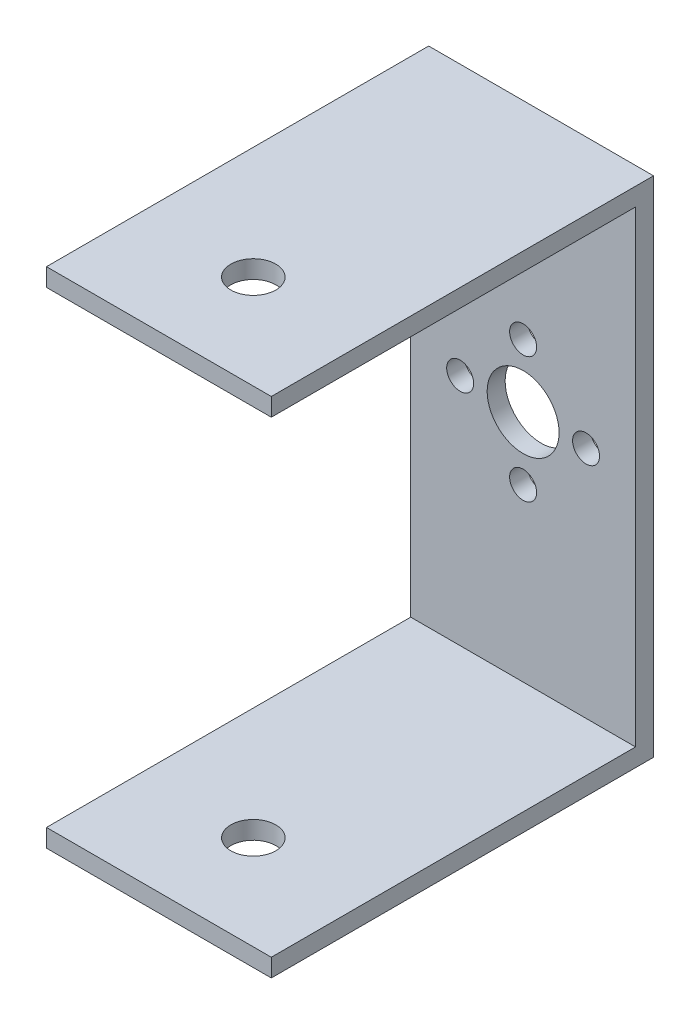
ISO-10303-21;
HEADER;
FILE_DESCRIPTION(('STEP AP214'),'2;1');
FILE_NAME('part.step','',(''),(''),'','','');
FILE_SCHEMA(('AUTOMOTIVE_DESIGN { 1 0 10303 214 1 1 1 1 }'));
ENDSEC;
DATA;
#1=APPLICATION_CONTEXT('core data for automotive mechanical design processes');
#2=APPLICATION_PROTOCOL_DEFINITION('international standard','automotive_design',2000,#1);
#3=PRODUCT_CONTEXT('',#1,'mechanical');
#4=PRODUCT('Part','Part','',(#3));
#5=PRODUCT_RELATED_PRODUCT_CATEGORY('part','',(#4));
#6=PRODUCT_DEFINITION_FORMATION('','',#4);
#7=PRODUCT_DEFINITION_CONTEXT('part definition',#1,'design');
#8=PRODUCT_DEFINITION('design','',#6,#7);
#9=PRODUCT_DEFINITION_SHAPE('','',#8);
#10=(LENGTH_UNIT() NAMED_UNIT(*) SI_UNIT(.MILLI.,.METRE.));
#11=(NAMED_UNIT(*) PLANE_ANGLE_UNIT() SI_UNIT($,.RADIAN.));
#12=(NAMED_UNIT(*) SI_UNIT($,.STERADIAN.) SOLID_ANGLE_UNIT());
#13=UNCERTAINTY_MEASURE_WITH_UNIT(LENGTH_MEASURE(1.E-05),#10,'distance_accuracy_value','');
#14=(GEOMETRIC_REPRESENTATION_CONTEXT(3) GLOBAL_UNCERTAINTY_ASSIGNED_CONTEXT((#13)) GLOBAL_UNIT_ASSIGNED_CONTEXT((#10,
#11,#12)) REPRESENTATION_CONTEXT('',''));
#15=CARTESIAN_POINT('',(0.,0.,0.));
#16=DIRECTION('',(0.,0.,1.));
#17=DIRECTION('',(1.,0.,0.));
#18=AXIS2_PLACEMENT_3D('',#15,#16,#17);
#19=CARTESIAN_POINT('',(-12.6747704507397,30.5029426241211,2.));
#20=DIRECTION('',(1.,0.,0.));
#21=DIRECTION('',(0.,1.,0.));
#22=AXIS2_PLACEMENT_3D('',#19,#20,#21);
#23=PLANE('',#22);
#24=DIRECTION('',(0.,-1.,0.));
#25=VECTOR('',#24,1.);
#26=CARTESIAN_POINT('',(-12.6747704507397,30.5029426241211,0.));
#27=LINE('',#26,#25);
#28=CARTESIAN_POINT('',(-12.6747704507397,32.5029426241211,0.));
#29=VERTEX_POINT('',#28);
#30=CARTESIAN_POINT('',(-12.6747704507397,-23.4970573758789,0.));
#31=VERTEX_POINT('',#30);
#32=EDGE_CURVE('E149',#29,#31,#27,.T.);
#33=ORIENTED_EDGE('',*,*,#32,.T.);
#34=DIRECTION('',(0.,0.,-1.));
#35=VECTOR('',#34,1.);
#36=CARTESIAN_POINT('',(-12.6747704507397,-23.4970573758789,0.));
#37=LINE('',#36,#35);
#38=CARTESIAN_POINT('',(-12.6747704507397,-23.4970573758789,42.5));
#39=VERTEX_POINT('',#38);
#40=EDGE_CURVE('E108',#39,#31,#37,.T.);
#41=ORIENTED_EDGE('',*,*,#40,.F.);
#42=DIRECTION('',(0.,1.,0.));
#43=VECTOR('',#42,1.);
#44=CARTESIAN_POINT('',(-12.6747704507397,-23.4970573758789,42.5));
#45=LINE('',#44,#43);
#46=CARTESIAN_POINT('',(-12.6747704507397,-21.4970573758789,42.5));
#47=VERTEX_POINT('',#46);
#48=EDGE_CURVE('E104',#39,#47,#45,.T.);
#49=ORIENTED_EDGE('',*,*,#48,.T.);
#50=DIRECTION('',(0.,0.,-1.));
#51=VECTOR('',#50,1.);
#52=CARTESIAN_POINT('',(-12.6747704507397,-21.4970573758789,0.));
#53=LINE('',#52,#51);
#54=CARTESIAN_POINT('',(-12.6747704507397,-21.4970573758789,2.));
#55=VERTEX_POINT('',#54);
#56=EDGE_CURVE('E117',#47,#55,#53,.T.);
#57=ORIENTED_EDGE('',*,*,#56,.T.);
#58=DIRECTION('',(0.,-1.,0.));
#59=VECTOR('',#58,1.);
#60=CARTESIAN_POINT('',(-12.6747704507397,30.5029426241211,2.));
#61=LINE('',#60,#59);
#62=CARTESIAN_POINT('',(-12.6747704507397,30.5029426241211,2.));
#63=VERTEX_POINT('',#62);
#64=EDGE_CURVE('E142',#63,#55,#61,.T.);
#65=ORIENTED_EDGE('',*,*,#64,.F.);
#66=DIRECTION('',(0.,0.,1.));
#67=VECTOR('',#66,1.);
#68=CARTESIAN_POINT('',(-12.6747704507397,30.5029426241211,0.));
#69=LINE('',#68,#67);
#70=CARTESIAN_POINT('',(-12.6747704507397,30.5029426241211,42.5));
#71=VERTEX_POINT('',#70);
#72=EDGE_CURVE('E49',#63,#71,#69,.T.);
#73=ORIENTED_EDGE('',*,*,#72,.T.);
#74=DIRECTION('',(0.,-1.,0.));
#75=VECTOR('',#74,1.);
#76=CARTESIAN_POINT('',(-12.6747704507397,32.5029426241211,42.5));
#77=LINE('',#76,#75);
#78=CARTESIAN_POINT('',(-12.6747704507397,32.5029426241211,42.5));
#79=VERTEX_POINT('',#78);
#80=EDGE_CURVE('E164',#79,#71,#77,.T.);
#81=ORIENTED_EDGE('',*,*,#80,.F.);
#82=DIRECTION('',(0.,0.,1.));
#83=VECTOR('',#82,1.);
#84=CARTESIAN_POINT('',(-12.6747704507397,32.5029426241211,0.));
#85=LINE('',#84,#83);
#86=EDGE_CURVE('E182',#29,#79,#85,.T.);
#87=ORIENTED_EDGE('',*,*,#86,.F.);
#88=EDGE_LOOP('',(#33,#41,#49,#57,#65,#73,#81,#87));
#89=FACE_BOUND('',#88,.T.);
#90=ADVANCED_FACE('F33',(#89),#23,.F.);
#91=CARTESIAN_POINT('',(12.3252295492603,30.5029426241211,2.));
#92=DIRECTION('',(-1.,0.,0.));
#93=DIRECTION('',(0.,-1.,0.));
#94=AXIS2_PLACEMENT_3D('',#91,#92,#93);
#95=PLANE('',#94);
#96=DIRECTION('',(0.,1.,0.));
#97=VECTOR('',#96,1.);
#98=CARTESIAN_POINT('',(12.3252295492603,30.5029426241211,0.));
#99=LINE('',#98,#97);
#100=CARTESIAN_POINT('',(12.3252295492603,-23.4970573758789,0.));
#101=VERTEX_POINT('',#100);
#102=CARTESIAN_POINT('',(12.3252295492603,32.5029426241211,0.));
#103=VERTEX_POINT('',#102);
#104=EDGE_CURVE('E147',#101,#103,#99,.T.);
#105=ORIENTED_EDGE('',*,*,#104,.T.);
#106=DIRECTION('',(0.,0.,-1.));
#107=VECTOR('',#106,1.);
#108=CARTESIAN_POINT('',(12.3252295492603,32.5029426241211,0.));
#109=LINE('',#108,#107);
#110=CARTESIAN_POINT('',(12.3252295492603,32.5029426241211,42.5));
#111=VERTEX_POINT('',#110);
#112=EDGE_CURVE('E188',#111,#103,#109,.T.);
#113=ORIENTED_EDGE('',*,*,#112,.F.);
#114=DIRECTION('',(0.,-1.,0.));
#115=VECTOR('',#114,1.);
#116=CARTESIAN_POINT('',(12.3252295492603,32.5029426241211,42.5));
#117=LINE('',#116,#115);
#118=CARTESIAN_POINT('',(12.3252295492603,30.5029426241211,42.5));
#119=VERTEX_POINT('',#118);
#120=EDGE_CURVE('E167',#111,#119,#117,.T.);
#121=ORIENTED_EDGE('',*,*,#120,.T.);
#122=DIRECTION('',(0.,0.,-1.));
#123=VECTOR('',#122,1.);
#124=CARTESIAN_POINT('',(12.3252295492603,30.5029426241211,0.));
#125=LINE('',#124,#123);
#126=CARTESIAN_POINT('',(12.3252295492603,30.5029426241211,2.));
#127=VERTEX_POINT('',#126);
#128=EDGE_CURVE('E160',#119,#127,#125,.T.);
#129=ORIENTED_EDGE('',*,*,#128,.T.);
#130=DIRECTION('',(0.,1.,0.));
#131=VECTOR('',#130,1.);
#132=CARTESIAN_POINT('',(12.3252295492603,30.5029426241211,2.));
#133=LINE('',#132,#131);
#134=CARTESIAN_POINT('',(12.3252295492603,-21.4970573758789,2.));
#135=VERTEX_POINT('',#134);
#136=EDGE_CURVE('E41',#135,#127,#133,.T.);
#137=ORIENTED_EDGE('',*,*,#136,.F.);
#138=DIRECTION('',(0.,0.,1.));
#139=VECTOR('',#138,1.);
#140=CARTESIAN_POINT('',(12.3252295492603,-21.4970573758789,0.));
#141=LINE('',#140,#139);
#142=CARTESIAN_POINT('',(12.3252295492603,-21.4970573758789,42.5));
#143=VERTEX_POINT('',#142);
#144=EDGE_CURVE('E56',#135,#143,#141,.T.);
#145=ORIENTED_EDGE('',*,*,#144,.T.);
#146=DIRECTION('',(0.,1.,0.));
#147=VECTOR('',#146,1.);
#148=CARTESIAN_POINT('',(12.3252295492603,-23.4970573758789,42.5));
#149=LINE('',#148,#147);
#150=CARTESIAN_POINT('',(12.3252295492603,-23.4970573758789,42.5));
#151=VERTEX_POINT('',#150);
#152=EDGE_CURVE('E102',#151,#143,#149,.T.);
#153=ORIENTED_EDGE('',*,*,#152,.F.);
#154=DIRECTION('',(0.,0.,1.));
#155=VECTOR('',#154,1.);
#156=CARTESIAN_POINT('',(12.3252295492603,-23.4970573758789,0.));
#157=LINE('',#156,#155);
#158=EDGE_CURVE('E109',#101,#151,#157,.T.);
#159=ORIENTED_EDGE('',*,*,#158,.F.);
#160=EDGE_LOOP('',(#105,#113,#121,#129,#137,#145,#153,#159));
#161=FACE_BOUND('',#160,.T.);
#162=ADVANCED_FACE('F119',(#161),#95,.F.);
#163=CARTESIAN_POINT('',(0.,0.,2.));
#164=DIRECTION('',(0.,0.,1.));
#165=DIRECTION('',(1.,0.,0.));
#166=AXIS2_PLACEMENT_3D('',#163,#164,#165);
#167=PLANE('',#166);
#168=CARTESIAN_POINT('',(-0.174770450739801,11.5029426241211,2.));
#169=DIRECTION('',(0.,0.,1.));
#170=DIRECTION('',(1.,0.,0.));
#171=AXIS2_PLACEMENT_3D('',#168,#169,#170);
#172=CIRCLE('',#171,1.5);
#173=CARTESIAN_POINT('',(1.3252295492602,11.5029426241211,2.));
#174=VERTEX_POINT('',#173);
#175=EDGE_CURVE('E340',#174,#174,#172,.T.);
#176=ORIENTED_EDGE('',*,*,#175,.F.);
#177=EDGE_LOOP('',(#176));
#178=FACE_BOUND('',#177,.T.);
#179=CARTESIAN_POINT('',(6.82522954926027,4.50294262412115,2.));
#180=DIRECTION('',(0.,0.,1.));
#181=DIRECTION('',(1.,0.,0.));
#182=AXIS2_PLACEMENT_3D('',#179,#180,#181);
#183=CIRCLE('',#182,1.5);
#184=CARTESIAN_POINT('',(8.32522954926028,4.50294262412115,2.));
#185=VERTEX_POINT('',#184);
#186=EDGE_CURVE('E350',#185,#185,#183,.T.);
#187=ORIENTED_EDGE('',*,*,#186,.F.);
#188=EDGE_LOOP('',(#187));
#189=FACE_BOUND('',#188,.T.);
#190=CARTESIAN_POINT('',(-0.174770450739701,-2.4970573758789,2.));
#191=DIRECTION('',(0.,0.,1.));
#192=DIRECTION('',(1.,0.,0.));
#193=AXIS2_PLACEMENT_3D('',#190,#191,#192);
#194=CIRCLE('',#193,1.5);
#195=CARTESIAN_POINT('',(1.3252295492603,-2.4970573758789,2.));
#196=VERTEX_POINT('',#195);
#197=EDGE_CURVE('E356',#196,#196,#194,.T.);
#198=ORIENTED_EDGE('',*,*,#197,.F.);
#199=EDGE_LOOP('',(#198));
#200=FACE_BOUND('',#199,.T.);
#201=CARTESIAN_POINT('',(-7.17477045073973,4.5029426241211,2.));
#202=DIRECTION('',(0.,0.,1.));
#203=DIRECTION('',(1.,0.,0.));
#204=AXIS2_PLACEMENT_3D('',#201,#202,#203);
#205=CIRCLE('',#204,1.5);
#206=CARTESIAN_POINT('',(-5.67477045073973,4.5029426241211,2.));
#207=VERTEX_POINT('',#206);
#208=EDGE_CURVE('E362',#207,#207,#205,.T.);
#209=ORIENTED_EDGE('',*,*,#208,.F.);
#210=EDGE_LOOP('',(#209));
#211=FACE_BOUND('',#210,.T.);
#212=CARTESIAN_POINT('',(-0.174770450739726,4.5029426241211,2.));
#213=DIRECTION('',(0.,0.,1.));
#214=DIRECTION('',(1.,0.,0.));
#215=AXIS2_PLACEMENT_3D('',#212,#213,#214);
#216=CIRCLE('',#215,4.);
#217=CARTESIAN_POINT('',(3.82522954926027,4.5029426241211,2.));
#218=VERTEX_POINT('',#217);
#219=EDGE_CURVE('E368',#218,#218,#216,.T.);
#220=ORIENTED_EDGE('',*,*,#219,.F.);
#221=EDGE_LOOP('',(#220));
#222=FACE_BOUND('',#221,.T.);
#223=ORIENTED_EDGE('',*,*,#64,.T.);
#224=DIRECTION('',(1.,0.,0.));
#225=VECTOR('',#224,1.);
#226=CARTESIAN_POINT('',(-12.6747704507397,-21.4970573758789,2.));
#227=LINE('',#226,#225);
#228=EDGE_CURVE('E146',#55,#135,#227,.T.);
#229=ORIENTED_EDGE('',*,*,#228,.T.);
#230=ORIENTED_EDGE('',*,*,#136,.T.);
#231=DIRECTION('',(-1.,0.,0.));
#232=VECTOR('',#231,1.);
#233=CARTESIAN_POINT('',(-12.6747704507397,30.5029426241211,2.));
#234=LINE('',#233,#232);
#235=EDGE_CURVE('E11',#127,#63,#234,.T.);
#236=ORIENTED_EDGE('',*,*,#235,.T.);
#237=EDGE_LOOP('',(#223,#229,#230,#236));
#238=FACE_BOUND('',#237,.T.);
#239=ADVANCED_FACE('F144',(#178,#189,#200,#211,#222,#238),#167,.T.);
#240=CARTESIAN_POINT('',(0.,0.,0.));
#241=DIRECTION('',(0.,0.,1.));
#242=DIRECTION('',(1.,0.,0.));
#243=AXIS2_PLACEMENT_3D('',#240,#241,#242);
#244=PLANE('',#243);
#245=CARTESIAN_POINT('',(-0.174770450739801,11.5029426241211,0.));
#246=DIRECTION('',(0.,0.,-1.));
#247=DIRECTION('',(-1.,0.,0.));
#248=AXIS2_PLACEMENT_3D('',#245,#246,#247);
#249=CIRCLE('',#248,1.5);
#250=CARTESIAN_POINT('',(-1.6747704507398,11.5029426241211,0.));
#251=VERTEX_POINT('',#250);
#252=EDGE_CURVE('E343',#251,#251,#249,.T.);
#253=ORIENTED_EDGE('',*,*,#252,.F.);
#254=EDGE_LOOP('',(#253));
#255=FACE_BOUND('',#254,.T.);
#256=CARTESIAN_POINT('',(6.82522954926027,4.50294262412115,0.));
#257=DIRECTION('',(0.,0.,-1.));
#258=DIRECTION('',(-1.,0.,0.));
#259=AXIS2_PLACEMENT_3D('',#256,#257,#258);
#260=CIRCLE('',#259,1.5);
#261=CARTESIAN_POINT('',(5.32522954926027,4.50294262412115,0.));
#262=VERTEX_POINT('',#261);
#263=EDGE_CURVE('E345',#262,#262,#260,.T.);
#264=ORIENTED_EDGE('',*,*,#263,.F.);
#265=EDGE_LOOP('',(#264));
#266=FACE_BOUND('',#265,.T.);
#267=CARTESIAN_POINT('',(-0.174770450739701,-2.4970573758789,0.));
#268=DIRECTION('',(0.,0.,-1.));
#269=DIRECTION('',(-1.,0.,0.));
#270=AXIS2_PLACEMENT_3D('',#267,#268,#269);
#271=CIRCLE('',#270,1.5);
#272=CARTESIAN_POINT('',(-1.6747704507397,-2.4970573758789,0.));
#273=VERTEX_POINT('',#272);
#274=EDGE_CURVE('E353',#273,#273,#271,.T.);
#275=ORIENTED_EDGE('',*,*,#274,.F.);
#276=EDGE_LOOP('',(#275));
#277=FACE_BOUND('',#276,.T.);
#278=CARTESIAN_POINT('',(-7.17477045073973,4.5029426241211,0.));
#279=DIRECTION('',(0.,0.,-1.));
#280=DIRECTION('',(-1.,0.,0.));
#281=AXIS2_PLACEMENT_3D('',#278,#279,#280);
#282=CIRCLE('',#281,1.5);
#283=CARTESIAN_POINT('',(-8.67477045073973,4.5029426241211,0.));
#284=VERTEX_POINT('',#283);
#285=EDGE_CURVE('E359',#284,#284,#282,.T.);
#286=ORIENTED_EDGE('',*,*,#285,.F.);
#287=EDGE_LOOP('',(#286));
#288=FACE_BOUND('',#287,.T.);
#289=CARTESIAN_POINT('',(-0.174770450739726,4.5029426241211,0.));
#290=DIRECTION('',(0.,0.,-1.));
#291=DIRECTION('',(-1.,0.,0.));
#292=AXIS2_PLACEMENT_3D('',#289,#290,#291);
#293=CIRCLE('',#292,4.);
#294=CARTESIAN_POINT('',(-4.17477045073973,4.5029426241211,0.));
#295=VERTEX_POINT('',#294);
#296=EDGE_CURVE('E365',#295,#295,#293,.T.);
#297=ORIENTED_EDGE('',*,*,#296,.F.);
#298=EDGE_LOOP('',(#297));
#299=FACE_BOUND('',#298,.T.);
#300=ORIENTED_EDGE('',*,*,#32,.F.);
#301=DIRECTION('',(-1.,0.,0.));
#302=VECTOR('',#301,1.);
#303=CARTESIAN_POINT('',(-12.6747704507397,32.5029426241211,0.));
#304=LINE('',#303,#302);
#305=EDGE_CURVE('E172',#103,#29,#304,.T.);
#306=ORIENTED_EDGE('',*,*,#305,.F.);
#307=ORIENTED_EDGE('',*,*,#104,.F.);
#308=DIRECTION('',(1.,0.,0.));
#309=VECTOR('',#308,1.);
#310=CARTESIAN_POINT('',(12.3252295492603,-23.4970573758789,0.));
#311=LINE('',#310,#309);
#312=EDGE_CURVE('E115',#31,#101,#311,.T.);
#313=ORIENTED_EDGE('',*,*,#312,.F.);
#314=EDGE_LOOP('',(#300,#306,#307,#313));
#315=FACE_BOUND('',#314,.T.);
#316=ADVANCED_FACE('F217',(#255,#266,#277,#288,#299,#315),#244,.F.);
#317=CARTESIAN_POINT('',(-12.6747704507397,32.5029426241211,42.5));
#318=DIRECTION('',(0.,0.,-1.));
#319=DIRECTION('',(-1.,0.,0.));
#320=AXIS2_PLACEMENT_3D('',#317,#318,#319);
#321=PLANE('',#320);
#322=DIRECTION('',(1.,0.,0.));
#323=VECTOR('',#322,1.);
#324=CARTESIAN_POINT('',(-12.6747704507397,30.5029426241211,42.5));
#325=LINE('',#324,#323);
#326=EDGE_CURVE('E122',#71,#119,#325,.T.);
#327=ORIENTED_EDGE('',*,*,#326,.T.);
#328=ORIENTED_EDGE('',*,*,#120,.F.);
#329=DIRECTION('',(1.,0.,0.));
#330=VECTOR('',#329,1.);
#331=CARTESIAN_POINT('',(-12.6747704507397,32.5029426241211,42.5));
#332=LINE('',#331,#330);
#333=EDGE_CURVE('E185',#79,#111,#332,.T.);
#334=ORIENTED_EDGE('',*,*,#333,.F.);
#335=ORIENTED_EDGE('',*,*,#80,.T.);
#336=EDGE_LOOP('',(#327,#328,#334,#335));
#337=FACE_BOUND('',#336,.T.);
#338=ADVANCED_FACE('F204',(#337),#321,.F.);
#339=CARTESIAN_POINT('',(0.,32.5029426241211,0.));
#340=DIRECTION('',(0.,1.,0.));
#341=DIRECTION('',(0.,0.,1.));
#342=AXIS2_PLACEMENT_3D('',#339,#340,#341);
#343=PLANE('',#342);
#344=CARTESIAN_POINT('',(-0.174770450739726,32.5029426241211,32.));
#345=DIRECTION('',(0.,1.,0.));
#346=DIRECTION('',(0.,0.,1.));
#347=AXIS2_PLACEMENT_3D('',#344,#345,#346);
#348=CIRCLE('',#347,2.5);
#349=CARTESIAN_POINT('',(-0.174770450739726,32.5029426241211,34.5));
#350=VERTEX_POINT('',#349);
#351=EDGE_CURVE('E371',#350,#350,#348,.T.);
#352=ORIENTED_EDGE('',*,*,#351,.F.);
#353=EDGE_LOOP('',(#352));
#354=FACE_BOUND('',#353,.T.);
#355=ORIENTED_EDGE('',*,*,#86,.T.);
#356=ORIENTED_EDGE('',*,*,#333,.T.);
#357=ORIENTED_EDGE('',*,*,#112,.T.);
#358=ORIENTED_EDGE('',*,*,#305,.T.);
#359=EDGE_LOOP('',(#355,#356,#357,#358));
#360=FACE_BOUND('',#359,.T.);
#361=ADVANCED_FACE('F193',(#354,#360),#343,.T.);
#362=CARTESIAN_POINT('',(0.,30.5029426241211,0.));
#363=DIRECTION('',(0.,1.,0.));
#364=DIRECTION('',(0.,0.,1.));
#365=AXIS2_PLACEMENT_3D('',#362,#363,#364);
#366=PLANE('',#365);
#367=CARTESIAN_POINT('',(-0.174770450739726,30.5029426241211,32.));
#368=DIRECTION('',(0.,1.,0.));
#369=DIRECTION('',(0.,0.,1.));
#370=AXIS2_PLACEMENT_3D('',#367,#368,#369);
#371=CIRCLE('',#370,2.5);
#372=CARTESIAN_POINT('',(-0.174770450739726,30.5029426241211,34.5));
#373=VERTEX_POINT('',#372);
#374=EDGE_CURVE('E130',#373,#373,#371,.T.);
#375=ORIENTED_EDGE('',*,*,#374,.T.);
#376=EDGE_LOOP('',(#375));
#377=FACE_BOUND('',#376,.T.);
#378=ORIENTED_EDGE('',*,*,#235,.F.);
#379=ORIENTED_EDGE('',*,*,#128,.F.);
#380=ORIENTED_EDGE('',*,*,#326,.F.);
#381=ORIENTED_EDGE('',*,*,#72,.F.);
#382=EDGE_LOOP('',(#378,#379,#380,#381));
#383=FACE_BOUND('',#382,.T.);
#384=ADVANCED_FACE('F195',(#377,#383),#366,.F.);
#385=CARTESIAN_POINT('',(12.3252295492603,-23.4970573758789,42.5));
#386=DIRECTION('',(0.,0.,-1.));
#387=DIRECTION('',(-1.,0.,0.));
#388=AXIS2_PLACEMENT_3D('',#385,#386,#387);
#389=PLANE('',#388);
#390=DIRECTION('',(-1.,0.,0.));
#391=VECTOR('',#390,1.);
#392=CARTESIAN_POINT('',(12.3252295492603,-21.4970573758789,42.5));
#393=LINE('',#392,#391);
#394=EDGE_CURVE('E129',#143,#47,#393,.T.);
#395=ORIENTED_EDGE('',*,*,#394,.T.);
#396=ORIENTED_EDGE('',*,*,#48,.F.);
#397=DIRECTION('',(-1.,0.,0.));
#398=VECTOR('',#397,1.);
#399=CARTESIAN_POINT('',(12.3252295492603,-23.4970573758789,42.5));
#400=LINE('',#399,#398);
#401=EDGE_CURVE('E98',#151,#39,#400,.T.);
#402=ORIENTED_EDGE('',*,*,#401,.F.);
#403=ORIENTED_EDGE('',*,*,#152,.T.);
#404=EDGE_LOOP('',(#395,#396,#402,#403));
#405=FACE_BOUND('',#404,.T.);
#406=ADVANCED_FACE('F100',(#405),#389,.F.);
#407=CARTESIAN_POINT('',(0.,-23.4970573758789,0.));
#408=DIRECTION('',(0.,-1.,0.));
#409=DIRECTION('',(0.,0.,-1.));
#410=AXIS2_PLACEMENT_3D('',#407,#408,#409);
#411=PLANE('',#410);
#412=CARTESIAN_POINT('',(-0.174770450739726,-23.4970573758789,32.));
#413=DIRECTION('',(0.,-1.,0.));
#414=DIRECTION('',(0.,0.,-1.));
#415=AXIS2_PLACEMENT_3D('',#412,#413,#414);
#416=CIRCLE('',#415,2.5);
#417=CARTESIAN_POINT('',(-0.174770450739726,-23.4970573758789,29.5));
#418=VERTEX_POINT('',#417);
#419=EDGE_CURVE('E374',#418,#418,#416,.T.);
#420=ORIENTED_EDGE('',*,*,#419,.F.);
#421=EDGE_LOOP('',(#420));
#422=FACE_BOUND('',#421,.T.);
#423=ORIENTED_EDGE('',*,*,#158,.T.);
#424=ORIENTED_EDGE('',*,*,#401,.T.);
#425=ORIENTED_EDGE('',*,*,#40,.T.);
#426=ORIENTED_EDGE('',*,*,#312,.T.);
#427=EDGE_LOOP('',(#423,#424,#425,#426));
#428=FACE_BOUND('',#427,.T.);
#429=ADVANCED_FACE('F113',(#422,#428),#411,.T.);
#430=CARTESIAN_POINT('',(0.,-21.4970573758789,0.));
#431=DIRECTION('',(0.,-1.,0.));
#432=DIRECTION('',(0.,0.,-1.));
#433=AXIS2_PLACEMENT_3D('',#430,#431,#432);
#434=PLANE('',#433);
#435=CARTESIAN_POINT('',(-0.174770450739726,-21.4970573758789,32.));
#436=DIRECTION('',(0.,-1.,0.));
#437=DIRECTION('',(0.,0.,-1.));
#438=AXIS2_PLACEMENT_3D('',#435,#436,#437);
#439=CIRCLE('',#438,2.5);
#440=CARTESIAN_POINT('',(-0.174770450739726,-21.4970573758789,29.5));
#441=VERTEX_POINT('',#440);
#442=EDGE_CURVE('E36',#441,#441,#439,.T.);
#443=ORIENTED_EDGE('',*,*,#442,.T.);
#444=EDGE_LOOP('',(#443));
#445=FACE_BOUND('',#444,.T.);
#446=ORIENTED_EDGE('',*,*,#228,.F.);
#447=ORIENTED_EDGE('',*,*,#56,.F.);
#448=ORIENTED_EDGE('',*,*,#394,.F.);
#449=ORIENTED_EDGE('',*,*,#144,.F.);
#450=EDGE_LOOP('',(#446,#447,#448,#449));
#451=FACE_BOUND('',#450,.T.);
#452=ADVANCED_FACE('F250',(#445,#451),#434,.F.);
#453=CARTESIAN_POINT('',(-0.174770450739726,-37.4970573758789,32.));
#454=DIRECTION('',(0.,1.,0.));
#455=DIRECTION('',(0.,0.,1.));
#456=AXIS2_PLACEMENT_3D('',#453,#454,#455);
#457=CYLINDRICAL_SURFACE('',#456,2.5);
#458=ORIENTED_EDGE('',*,*,#419,.T.);
#459=EDGE_LOOP('',(#458));
#460=FACE_BOUND('',#459,.T.);
#461=ORIENTED_EDGE('',*,*,#442,.F.);
#462=EDGE_LOOP('',(#461));
#463=FACE_BOUND('',#462,.T.);
#464=ADVANCED_FACE('F260',(#460,#463),#457,.F.);
#465=ORIENTED_EDGE('',*,*,#351,.T.);
#466=EDGE_LOOP('',(#465));
#467=FACE_BOUND('',#466,.T.);
#468=ORIENTED_EDGE('',*,*,#374,.F.);
#469=EDGE_LOOP('',(#468));
#470=FACE_BOUND('',#469,.T.);
#471=ADVANCED_FACE('F270',(#467,#470),#457,.F.);
#472=CARTESIAN_POINT('',(-0.174770450739726,4.5029426241211,21.));
#473=DIRECTION('',(0.,0.,-1.));
#474=DIRECTION('',(-1.,0.,0.));
#475=AXIS2_PLACEMENT_3D('',#472,#473,#474);
#476=CYLINDRICAL_SURFACE('',#475,4.);
#477=ORIENTED_EDGE('',*,*,#219,.T.);
#478=EDGE_LOOP('',(#477));
#479=FACE_BOUND('',#478,.T.);
#480=ORIENTED_EDGE('',*,*,#296,.T.);
#481=EDGE_LOOP('',(#480));
#482=FACE_BOUND('',#481,.T.);
#483=ADVANCED_FACE('F280',(#479,#482),#476,.F.);
#484=CARTESIAN_POINT('',(-7.17477045073973,4.5029426241211,21.));
#485=DIRECTION('',(0.,0.,-1.));
#486=DIRECTION('',(-1.,0.,0.));
#487=AXIS2_PLACEMENT_3D('',#484,#485,#486);
#488=CYLINDRICAL_SURFACE('',#487,1.5);
#489=ORIENTED_EDGE('',*,*,#208,.T.);
#490=EDGE_LOOP('',(#489));
#491=FACE_BOUND('',#490,.T.);
#492=ORIENTED_EDGE('',*,*,#285,.T.);
#493=EDGE_LOOP('',(#492));
#494=FACE_BOUND('',#493,.T.);
#495=ADVANCED_FACE('F288',(#491,#494),#488,.F.);
#496=CARTESIAN_POINT('',(-0.174770450739701,-2.4970573758789,21.));
#497=DIRECTION('',(0.,0.,-1.));
#498=DIRECTION('',(-1.,0.,0.));
#499=AXIS2_PLACEMENT_3D('',#496,#497,#498);
#500=CYLINDRICAL_SURFACE('',#499,1.5);
#501=ORIENTED_EDGE('',*,*,#197,.T.);
#502=EDGE_LOOP('',(#501));
#503=FACE_BOUND('',#502,.T.);
#504=ORIENTED_EDGE('',*,*,#274,.T.);
#505=EDGE_LOOP('',(#504));
#506=FACE_BOUND('',#505,.T.);
#507=ADVANCED_FACE('F303',(#503,#506),#500,.F.);
#508=CARTESIAN_POINT('',(6.82522954926027,4.50294262412115,21.));
#509=DIRECTION('',(0.,0.,-1.));
#510=DIRECTION('',(-1.,0.,0.));
#511=AXIS2_PLACEMENT_3D('',#508,#509,#510);
#512=CYLINDRICAL_SURFACE('',#511,1.5);
#513=ORIENTED_EDGE('',*,*,#186,.T.);
#514=EDGE_LOOP('',(#513));
#515=FACE_BOUND('',#514,.T.);
#516=ORIENTED_EDGE('',*,*,#263,.T.);
#517=EDGE_LOOP('',(#516));
#518=FACE_BOUND('',#517,.T.);
#519=ADVANCED_FACE('F313',(#515,#518),#512,.F.);
#520=CARTESIAN_POINT('',(-0.174770450739801,11.5029426241211,21.));
#521=DIRECTION('',(0.,0.,-1.));
#522=DIRECTION('',(-1.,0.,0.));
#523=AXIS2_PLACEMENT_3D('',#520,#521,#522);
#524=CYLINDRICAL_SURFACE('',#523,1.5);
#525=ORIENTED_EDGE('',*,*,#175,.T.);
#526=EDGE_LOOP('',(#525));
#527=FACE_BOUND('',#526,.T.);
#528=ORIENTED_EDGE('',*,*,#252,.T.);
#529=EDGE_LOOP('',(#528));
#530=FACE_BOUND('',#529,.T.);
#531=ADVANCED_FACE('F323',(#527,#530),#524,.F.);
#532=CLOSED_SHELL('',(#90,#162,#239,#316,#338,#361,#384,#406,#429,#452,#464,#471,#483,#495,#507,
#519,#531));
#533=MANIFOLD_SOLID_BREP('B2',#532);
#534=ADVANCED_BREP_SHAPE_REPRESENTATION('',(#18,#533),#14);
#535=SHAPE_DEFINITION_REPRESENTATION(#9,#534);
ENDSEC;
END-ISO-10303-21;
